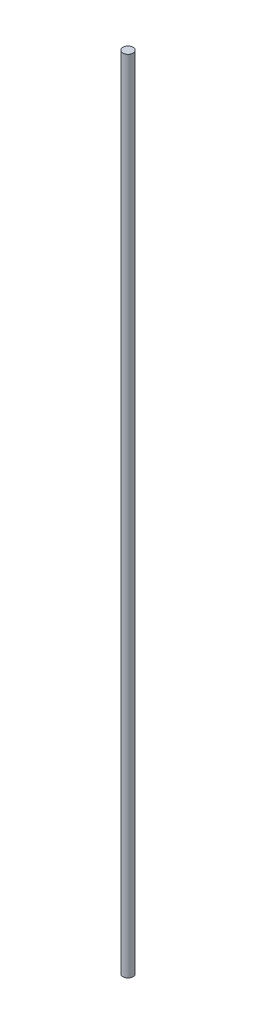
ISO-10303-21;
HEADER;
FILE_DESCRIPTION(('STEP AP214'),'2;1');
FILE_NAME('part.step','',(''),(''),'','','');
FILE_SCHEMA(('AUTOMOTIVE_DESIGN { 1 0 10303 214 1 1 1 1 }'));
ENDSEC;
DATA;
#1=APPLICATION_CONTEXT('core data for automotive mechanical design processes');
#2=APPLICATION_PROTOCOL_DEFINITION('international standard','automotive_design',2000,#1);
#3=PRODUCT_CONTEXT('',#1,'mechanical');
#4=PRODUCT('Part','Part','',(#3));
#5=PRODUCT_RELATED_PRODUCT_CATEGORY('part','',(#4));
#6=PRODUCT_DEFINITION_FORMATION('','',#4);
#7=PRODUCT_DEFINITION_CONTEXT('part definition',#1,'design');
#8=PRODUCT_DEFINITION('design','',#6,#7);
#9=PRODUCT_DEFINITION_SHAPE('','',#8);
#10=(LENGTH_UNIT() NAMED_UNIT(*) SI_UNIT(.MILLI.,.METRE.));
#11=(NAMED_UNIT(*) PLANE_ANGLE_UNIT() SI_UNIT($,.RADIAN.));
#12=(NAMED_UNIT(*) SI_UNIT($,.STERADIAN.) SOLID_ANGLE_UNIT());
#13=UNCERTAINTY_MEASURE_WITH_UNIT(LENGTH_MEASURE(1.E-05),#10,'distance_accuracy_value','');
#14=(GEOMETRIC_REPRESENTATION_CONTEXT(3) GLOBAL_UNCERTAINTY_ASSIGNED_CONTEXT((#13)) GLOBAL_UNIT_ASSIGNED_CONTEXT((#10,
#11,#12)) REPRESENTATION_CONTEXT('',''));
#15=CARTESIAN_POINT('',(0.,0.,0.));
#16=DIRECTION('',(0.,0.,1.));
#17=DIRECTION('',(1.,0.,0.));
#18=AXIS2_PLACEMENT_3D('',#15,#16,#17);
#19=CARTESIAN_POINT('',(0.,254.,0.));
#20=DIRECTION('',(0.,-1.,0.));
#21=DIRECTION('',(0.,0.,-1.));
#22=AXIS2_PLACEMENT_3D('',#19,#20,#21);
#23=CYLINDRICAL_SURFACE('',#22,1.61925);
#24=CARTESIAN_POINT('',(0.,254.,0.));
#25=DIRECTION('',(0.,1.,0.));
#26=DIRECTION('',(0.,0.,1.));
#27=AXIS2_PLACEMENT_3D('',#24,#25,#26);
#28=CIRCLE('',#27,1.61925);
#29=CARTESIAN_POINT('',(0.,254.,1.61925));
#30=VERTEX_POINT('',#29);
#31=EDGE_CURVE('E10',#30,#30,#28,.T.);
#32=ORIENTED_EDGE('',*,*,#31,.F.);
#33=EDGE_LOOP('',(#32));
#34=FACE_BOUND('',#33,.T.);
#35=CARTESIAN_POINT('',(0.,0.,0.));
#36=DIRECTION('',(0.,1.,0.));
#37=DIRECTION('',(0.,0.,1.));
#38=AXIS2_PLACEMENT_3D('',#35,#36,#37);
#39=CIRCLE('',#38,1.61925);
#40=CARTESIAN_POINT('',(0.,0.,1.61925));
#41=VERTEX_POINT('',#40);
#42=EDGE_CURVE('E48',#41,#41,#39,.T.);
#43=ORIENTED_EDGE('',*,*,#42,.T.);
#44=EDGE_LOOP('',(#43));
#45=FACE_BOUND('',#44,.T.);
#46=ADVANCED_FACE('F45',(#34,#45),#23,.T.);
#47=CARTESIAN_POINT('',(0.,254.,0.));
#48=DIRECTION('',(0.,1.,0.));
#49=DIRECTION('',(0.,0.,1.));
#50=AXIS2_PLACEMENT_3D('',#47,#48,#49);
#51=PLANE('',#50);
#52=ORIENTED_EDGE('',*,*,#31,.T.);
#53=EDGE_LOOP('',(#52));
#54=FACE_BOUND('',#53,.T.);
#55=ADVANCED_FACE('F62',(#54),#51,.T.);
#56=CARTESIAN_POINT('',(0.,0.,0.));
#57=DIRECTION('',(0.,1.,0.));
#58=DIRECTION('',(0.,0.,1.));
#59=AXIS2_PLACEMENT_3D('',#56,#57,#58);
#60=PLANE('',#59);
#61=ORIENTED_EDGE('',*,*,#42,.F.);
#62=EDGE_LOOP('',(#61));
#63=FACE_BOUND('',#62,.T.);
#64=ADVANCED_FACE('F60',(#63),#60,.F.);
#65=CLOSED_SHELL('',(#46,#55,#64));
#66=MANIFOLD_SOLID_BREP('B2',#65);
#67=ADVANCED_BREP_SHAPE_REPRESENTATION('',(#18,#66),#14);
#68=SHAPE_DEFINITION_REPRESENTATION(#9,#67);
ENDSEC;
END-ISO-10303-21;
